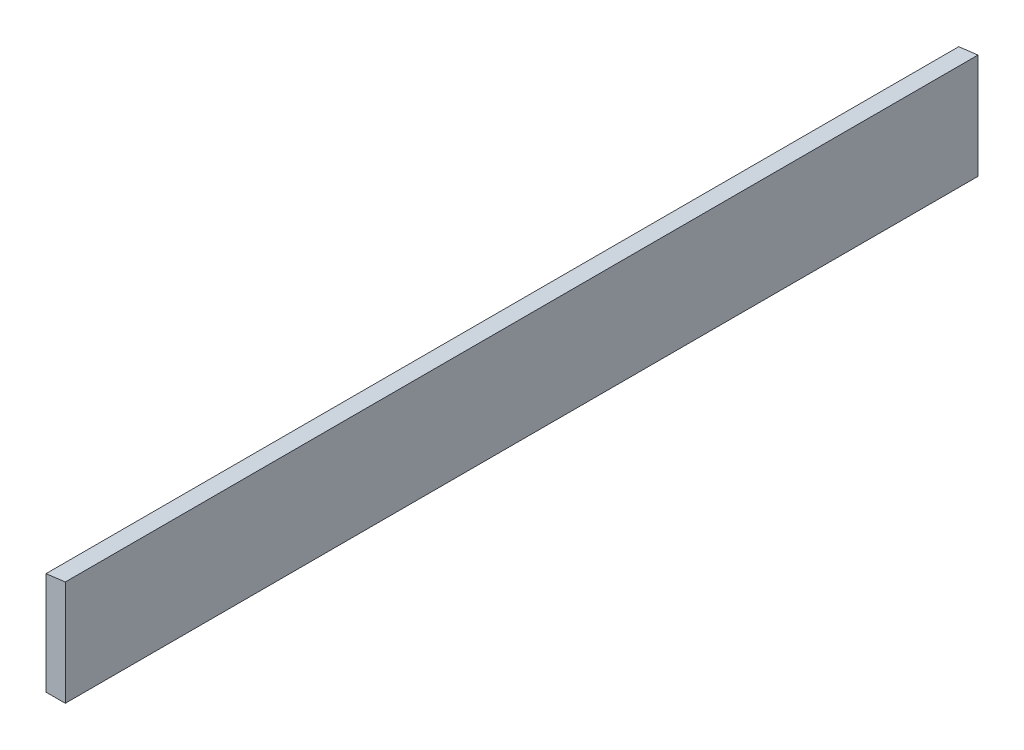
ISO-10303-21;
HEADER;
FILE_DESCRIPTION(('STEP AP214'),'2;1');
FILE_NAME('part.step','',(''),(''),'','','');
FILE_SCHEMA(('AUTOMOTIVE_DESIGN { 1 0 10303 214 1 1 1 1 }'));
ENDSEC;
DATA;
#1=APPLICATION_CONTEXT('core data for automotive mechanical design processes');
#2=APPLICATION_PROTOCOL_DEFINITION('international standard','automotive_design',2000,#1);
#3=PRODUCT_CONTEXT('',#1,'mechanical');
#4=PRODUCT('Part','Part','',(#3));
#5=PRODUCT_RELATED_PRODUCT_CATEGORY('part','',(#4));
#6=PRODUCT_DEFINITION_FORMATION('','',#4);
#7=PRODUCT_DEFINITION_CONTEXT('part definition',#1,'design');
#8=PRODUCT_DEFINITION('design','',#6,#7);
#9=PRODUCT_DEFINITION_SHAPE('','',#8);
#10=(LENGTH_UNIT() NAMED_UNIT(*) SI_UNIT(.MILLI.,.METRE.));
#11=(NAMED_UNIT(*) PLANE_ANGLE_UNIT() SI_UNIT($,.RADIAN.));
#12=(NAMED_UNIT(*) SI_UNIT($,.STERADIAN.) SOLID_ANGLE_UNIT());
#13=UNCERTAINTY_MEASURE_WITH_UNIT(LENGTH_MEASURE(1.E-05),#10,'distance_accuracy_value','');
#14=(GEOMETRIC_REPRESENTATION_CONTEXT(3) GLOBAL_UNCERTAINTY_ASSIGNED_CONTEXT((#13)) GLOBAL_UNIT_ASSIGNED_CONTEXT((#10,
#11,#12)) REPRESENTATION_CONTEXT('',''));
#15=CARTESIAN_POINT('',(0.,0.,0.));
#16=DIRECTION('',(0.,0.,1.));
#17=DIRECTION('',(1.,0.,0.));
#18=AXIS2_PLACEMENT_3D('',#15,#16,#17);
#19=CARTESIAN_POINT('',(251.836295427458,-8.07971550301567E-13,901.7));
#20=DIRECTION('',(1.,0.,0.));
#21=DIRECTION('',(0.,1.,0.));
#22=AXIS2_PLACEMENT_3D('',#19,#20,#21);
#23=PLANE('',#22);
#24=DIRECTION('',(0.,-1.,0.));
#25=VECTOR('',#24,1.);
#26=CARTESIAN_POINT('',(251.836295427458,-8.07971550301567E-13,0.));
#27=LINE('',#26,#25);
#28=CARTESIAN_POINT('',(251.836295427458,131.008148633834,0.));
#29=VERTEX_POINT('',#28);
#30=CARTESIAN_POINT('',(251.836295427458,27.1946714703701,0.));
#31=VERTEX_POINT('',#30);
#32=EDGE_CURVE('E96',#29,#31,#27,.T.);
#33=ORIENTED_EDGE('',*,*,#32,.F.);
#34=DIRECTION('',(0.,0.,-1.));
#35=VECTOR('',#34,1.);
#36=CARTESIAN_POINT('',(251.836295427458,131.008148633834,901.7));
#37=LINE('',#36,#35);
#38=CARTESIAN_POINT('',(251.836295427458,131.008148633834,901.7));
#39=VERTEX_POINT('',#38);
#40=EDGE_CURVE('E11',#39,#29,#37,.T.);
#41=ORIENTED_EDGE('',*,*,#40,.F.);
#42=DIRECTION('',(0.,-1.,0.));
#43=VECTOR('',#42,1.);
#44=CARTESIAN_POINT('',(251.836295427458,-8.07971550301567E-13,901.7));
#45=LINE('',#44,#43);
#46=CARTESIAN_POINT('',(251.836295427458,27.1946714703701,901.7));
#47=VERTEX_POINT('',#46);
#48=EDGE_CURVE('E84',#39,#47,#45,.T.);
#49=ORIENTED_EDGE('',*,*,#48,.T.);
#50=DIRECTION('',(0.,0.,-1.));
#51=VECTOR('',#50,1.);
#52=CARTESIAN_POINT('',(251.836295427458,27.1946714703701,901.7));
#53=LINE('',#52,#51);
#54=EDGE_CURVE('E73',#47,#31,#53,.T.);
#55=ORIENTED_EDGE('',*,*,#54,.T.);
#56=EDGE_LOOP('',(#33,#41,#49,#55));
#57=FACE_BOUND('',#56,.T.);
#58=ADVANCED_FACE('F34',(#57),#23,.T.);
#59=CARTESIAN_POINT('',(-12.2549370215559,97.9750202610744,901.7));
#60=DIRECTION('',(0.12411510301651,-0.992267827354692,0.));
#61=DIRECTION('',(0.992267827354692,0.12411510301651,0.));
#62=AXIS2_PLACEMENT_3D('',#59,#60,#61);
#63=PLANE('',#62);
#64=DIRECTION('',(-0.992267827354692,-0.12411510301651,0.));
#65=VECTOR('',#64,1.);
#66=CARTESIAN_POINT('',(-12.2549370215559,97.9750202610744,0.));
#67=LINE('',#66,#65);
#68=CARTESIAN_POINT('',(232.786295427458,128.625331568437,0.));
#69=VERTEX_POINT('',#68);
#70=EDGE_CURVE('E89',#29,#69,#67,.T.);
#71=ORIENTED_EDGE('',*,*,#70,.T.);
#72=DIRECTION('',(0.,0.,-1.));
#73=VECTOR('',#72,1.);
#74=CARTESIAN_POINT('',(232.786295427458,128.625331568437,901.7));
#75=LINE('',#74,#73);
#76=CARTESIAN_POINT('',(232.786295427458,128.625331568437,901.7));
#77=VERTEX_POINT('',#76);
#78=EDGE_CURVE('E42',#77,#69,#75,.T.);
#79=ORIENTED_EDGE('',*,*,#78,.F.);
#80=DIRECTION('',(-0.992267827354692,-0.12411510301651,0.));
#81=VECTOR('',#80,1.);
#82=CARTESIAN_POINT('',(-12.2549370215559,97.9750202610744,901.7));
#83=LINE('',#82,#81);
#84=EDGE_CURVE('E79',#39,#77,#83,.T.);
#85=ORIENTED_EDGE('',*,*,#84,.F.);
#86=ORIENTED_EDGE('',*,*,#40,.T.);
#87=EDGE_LOOP('',(#71,#79,#85,#86));
#88=FACE_BOUND('',#87,.T.);
#89=ADVANCED_FACE('F87',(#88),#63,.F.);
#90=CARTESIAN_POINT('',(232.786295427458,0.,901.7));
#91=DIRECTION('',(1.,0.,0.));
#92=DIRECTION('',(0.,1.,0.));
#93=AXIS2_PLACEMENT_3D('',#90,#91,#92);
#94=PLANE('',#93);
#95=DIRECTION('',(0.,-1.,0.));
#96=VECTOR('',#95,1.);
#97=CARTESIAN_POINT('',(232.786295427458,0.,0.));
#98=LINE('',#97,#96);
#99=CARTESIAN_POINT('',(232.786295427458,27.1946714703701,0.));
#100=VERTEX_POINT('',#99);
#101=EDGE_CURVE('E66',#69,#100,#98,.T.);
#102=ORIENTED_EDGE('',*,*,#101,.T.);
#103=DIRECTION('',(0.,0.,-1.));
#104=VECTOR('',#103,1.);
#105=CARTESIAN_POINT('',(232.786295427458,27.1946714703701,901.7));
#106=LINE('',#105,#104);
#107=CARTESIAN_POINT('',(232.786295427458,27.1946714703701,901.7));
#108=VERTEX_POINT('',#107);
#109=EDGE_CURVE('E90',#108,#100,#106,.T.);
#110=ORIENTED_EDGE('',*,*,#109,.F.);
#111=DIRECTION('',(0.,-1.,0.));
#112=VECTOR('',#111,1.);
#113=CARTESIAN_POINT('',(232.786295427458,0.,901.7));
#114=LINE('',#113,#112);
#115=EDGE_CURVE('E83',#77,#108,#114,.T.);
#116=ORIENTED_EDGE('',*,*,#115,.F.);
#117=ORIENTED_EDGE('',*,*,#78,.T.);
#118=EDGE_LOOP('',(#102,#110,#116,#117));
#119=FACE_BOUND('',#118,.T.);
#120=ADVANCED_FACE('F91',(#119),#94,.F.);
#121=CARTESIAN_POINT('',(0.,27.1946714703701,901.7));
#122=DIRECTION('',(0.,1.,0.));
#123=DIRECTION('',(0.,0.,1.));
#124=AXIS2_PLACEMENT_3D('',#121,#122,#123);
#125=PLANE('',#124);
#126=DIRECTION('',(1.,0.,0.));
#127=VECTOR('',#126,1.);
#128=CARTESIAN_POINT('',(0.,27.1946714703701,0.));
#129=LINE('',#128,#127);
#130=EDGE_CURVE('E101',#100,#31,#129,.T.);
#131=ORIENTED_EDGE('',*,*,#130,.T.);
#132=ORIENTED_EDGE('',*,*,#54,.F.);
#133=DIRECTION('',(1.,0.,0.));
#134=VECTOR('',#133,1.);
#135=CARTESIAN_POINT('',(0.,27.1946714703701,901.7));
#136=LINE('',#135,#134);
#137=EDGE_CURVE('E50',#108,#47,#136,.T.);
#138=ORIENTED_EDGE('',*,*,#137,.F.);
#139=ORIENTED_EDGE('',*,*,#109,.T.);
#140=EDGE_LOOP('',(#131,#132,#138,#139));
#141=FACE_BOUND('',#140,.T.);
#142=ADVANCED_FACE('F106',(#141),#125,.F.);
#143=CARTESIAN_POINT('',(0.,0.,901.7));
#144=DIRECTION('',(0.,0.,1.));
#145=DIRECTION('',(1.,0.,0.));
#146=AXIS2_PLACEMENT_3D('',#143,#144,#145);
#147=PLANE('',#146);
#148=ORIENTED_EDGE('',*,*,#48,.F.);
#149=ORIENTED_EDGE('',*,*,#84,.T.);
#150=ORIENTED_EDGE('',*,*,#115,.T.);
#151=ORIENTED_EDGE('',*,*,#137,.T.);
#152=EDGE_LOOP('',(#148,#149,#150,#151));
#153=FACE_BOUND('',#152,.T.);
#154=ADVANCED_FACE('F81',(#153),#147,.T.);
#155=CARTESIAN_POINT('',(0.,0.,0.));
#156=DIRECTION('',(0.,0.,1.));
#157=DIRECTION('',(1.,0.,0.));
#158=AXIS2_PLACEMENT_3D('',#155,#156,#157);
#159=PLANE('',#158);
#160=ORIENTED_EDGE('',*,*,#32,.T.);
#161=ORIENTED_EDGE('',*,*,#130,.F.);
#162=ORIENTED_EDGE('',*,*,#101,.F.);
#163=ORIENTED_EDGE('',*,*,#70,.F.);
#164=EDGE_LOOP('',(#160,#161,#162,#163));
#165=FACE_BOUND('',#164,.T.);
#166=ADVANCED_FACE('F108',(#165),#159,.F.);
#167=CLOSED_SHELL('',(#58,#89,#120,#142,#154,#166));
#168=MANIFOLD_SOLID_BREP('B2',#167);
#169=ADVANCED_BREP_SHAPE_REPRESENTATION('',(#18,#168),#14);
#170=SHAPE_DEFINITION_REPRESENTATION(#9,#169);
ENDSEC;
END-ISO-10303-21;
